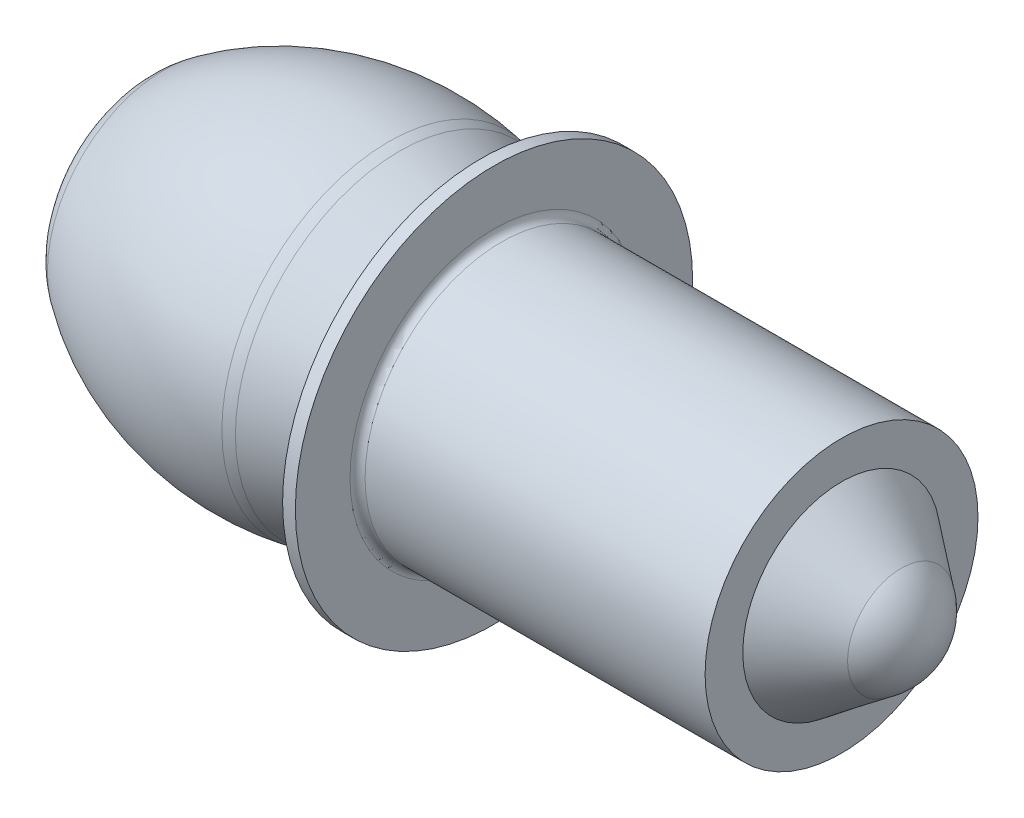
ISO-10303-21;
HEADER;
FILE_DESCRIPTION(('STEP AP214'),'2;1');
FILE_NAME('part.step','',(''),(''),'','','');
FILE_SCHEMA(('AUTOMOTIVE_DESIGN { 1 0 10303 214 1 1 1 1 }'));
ENDSEC;
DATA;
#1=APPLICATION_CONTEXT('core data for automotive mechanical design processes');
#2=APPLICATION_PROTOCOL_DEFINITION('international standard','automotive_design',2000,#1);
#3=PRODUCT_CONTEXT('',#1,'mechanical');
#4=PRODUCT('Part','Part','',(#3));
#5=PRODUCT_RELATED_PRODUCT_CATEGORY('part','',(#4));
#6=PRODUCT_DEFINITION_FORMATION('','',#4);
#7=PRODUCT_DEFINITION_CONTEXT('part definition',#1,'design');
#8=PRODUCT_DEFINITION('design','',#6,#7);
#9=PRODUCT_DEFINITION_SHAPE('','',#8);
#10=(LENGTH_UNIT() NAMED_UNIT(*) SI_UNIT(.MILLI.,.METRE.));
#11=(NAMED_UNIT(*) PLANE_ANGLE_UNIT() SI_UNIT($,.RADIAN.));
#12=(NAMED_UNIT(*) SI_UNIT($,.STERADIAN.) SOLID_ANGLE_UNIT());
#13=UNCERTAINTY_MEASURE_WITH_UNIT(LENGTH_MEASURE(1.E-05),#10,'distance_accuracy_value','');
#14=(GEOMETRIC_REPRESENTATION_CONTEXT(3) GLOBAL_UNCERTAINTY_ASSIGNED_CONTEXT((#13)) GLOBAL_UNIT_ASSIGNED_CONTEXT((#10,
#11,#12)) REPRESENTATION_CONTEXT('',''));
#15=CARTESIAN_POINT('',(0.,0.,0.));
#16=DIRECTION('',(0.,0.,1.));
#17=DIRECTION('',(1.,0.,0.));
#18=AXIS2_PLACEMENT_3D('',#15,#16,#17);
#19=CARTESIAN_POINT('',(0.155422630584212,-17.1253505507473,0.));
#20=DIRECTION('',(-1.,0.,0.));
#21=DIRECTION('',(0.,0.,1.));
#22=AXIS2_PLACEMENT_3D('',#19,#20,#21);
#23=PLANE('',#22);
#24=CARTESIAN_POINT('',(0.155422630584212,6.6929,0.));
#25=DIRECTION('',(-1.,0.,0.));
#26=DIRECTION('',(0.,0.,1.));
#27=AXIS2_PLACEMENT_3D('',#24,#25,#26);
#28=CIRCLE('',#27,0.030196754870487);
#29=CARTESIAN_POINT('',(0.155422630584212,6.6929,0.030196754870487));
#30=VERTEX_POINT('',#29);
#31=EDGE_CURVE('E11',#30,#30,#28,.T.);
#32=ORIENTED_EDGE('',*,*,#31,.T.);
#33=EDGE_LOOP('',(#32));
#34=FACE_BOUND('',#33,.T.);
#35=ADVANCED_FACE('F30',(#34),#23,.T.);
#36=CARTESIAN_POINT('',(0.790422630584212,6.6929,0.));
#37=DIRECTION('',(-1.,0.,0.));
#38=DIRECTION('',(0.,0.,1.));
#39=AXIS2_PLACEMENT_3D('',#36,#37,#38);
#40=DEGENERATE_TOROIDAL_SURFACE('',#39,0.0301967548704896,0.635,.T.);
#41=CARTESIAN_POINT('',(0.266573118640293,6.6929,0.));
#42=DIRECTION('',(-1.,0.,0.));
#43=DIRECTION('',(0.,0.,1.));
#44=AXIS2_PLACEMENT_3D('',#41,#42,#43);
#45=CIRCLE('',#44,0.389093242504629);
#46=CARTESIAN_POINT('',(0.266573118640293,6.6929,-0.389093242504629));
#47=VERTEX_POINT('',#46);
#48=EDGE_CURVE('E36',#47,#47,#45,.T.);
#49=ORIENTED_EDGE('',*,*,#48,.T.);
#50=EDGE_LOOP('',(#49));
#51=FACE_BOUND('',#50,.T.);
#52=ORIENTED_EDGE('',*,*,#31,.F.);
#53=EDGE_LOOP('',(#52));
#54=FACE_BOUND('',#53,.T.);
#55=ADVANCED_FACE('F88',(#51,#54),#40,.T.);
#56=CARTESIAN_POINT('',(0.266573118640293,6.6929,0.));
#57=DIRECTION('',(1.,0.,0.));
#58=DIRECTION('',(0.,0.,-1.));
#59=AXIS2_PLACEMENT_3D('',#56,#57,#58);
#60=CONICAL_SURFACE('',#59,0.389093242504629,0.970131178399944);
#61=CARTESIAN_POINT('',(0.906722652079457,6.6929,0.));
#62=DIRECTION('',(-1.,0.,0.));
#63=DIRECTION('',(0.,0.,1.));
#64=AXIS2_PLACEMENT_3D('',#61,#62,#63);
#65=CIRCLE('',#64,1.32346299037767);
#66=CARTESIAN_POINT('',(0.906722652079457,6.6929,-1.32346299037767));
#67=VERTEX_POINT('',#66);
#68=EDGE_CURVE('E83',#67,#67,#65,.T.);
#69=CARTESIAN_POINT('',(0.906722652079457,6.6929,-1.32346299037767));
#70=CARTESIAN_POINT('',(0.900054427772799,6.6929,-1.31372997217066));
#71=CARTESIAN_POINT('',(0.893386203466141,6.6929,-1.30399695396365));
#72=CARTESIAN_POINT('',(0.880049754852825,6.6929,-1.28453091754963));
#73=CARTESIAN_POINT('',(0.873381530546167,6.6929,-1.27479789934262));
#74=CARTESIAN_POINT('',(0.860045081932851,6.6929,-1.2553318629286));
#75=CARTESIAN_POINT('',(0.853376857626193,6.6929,-1.24559884472159));
#76=CARTESIAN_POINT('',(0.840040409012877,6.6929,-1.22613280830757));
#77=CARTESIAN_POINT('',(0.833372184706219,6.6929,-1.21639979010055));
#78=CARTESIAN_POINT('',(0.820035736092903,6.6929,-1.19693375368653));
#79=CARTESIAN_POINT('',(0.813367511786245,6.6929,-1.18720073547952));
#80=CARTESIAN_POINT('',(0.800031063172929,6.6929,-1.1677346990655));
#81=CARTESIAN_POINT('',(0.793362838866272,6.6929,-1.15800168085849));
#82=CARTESIAN_POINT('',(0.780026390252956,6.6929,-1.13853564444447));
#83=CARTESIAN_POINT('',(0.773358165946298,6.6929,-1.12880262623746));
#84=CARTESIAN_POINT('',(0.760021717332982,6.6929,-1.10933658982344));
#85=CARTESIAN_POINT('',(0.753353493026324,6.6929,-1.09960357161642));
#86=CARTESIAN_POINT('',(0.740017044413008,6.6929,-1.0801375352024));
#87=CARTESIAN_POINT('',(0.73334882010635,6.6929,-1.07040451699539));
#88=CARTESIAN_POINT('',(0.720012371493034,6.6929,-1.05093848058137));
#89=CARTESIAN_POINT('',(0.713344147186376,6.6929,-1.04120546237436));
#90=CARTESIAN_POINT('',(0.70000769857306,6.6929,-1.02173942596034));
#91=CARTESIAN_POINT('',(0.693339474266402,6.6929,-1.01200640775333));
#92=CARTESIAN_POINT('',(0.680003025653086,6.6929,-0.992540371339305));
#93=CARTESIAN_POINT('',(0.673334801346428,6.6929,-0.982807353132294));
#94=CARTESIAN_POINT('',(0.659998352733112,6.6929,-0.963341316718272));
#95=CARTESIAN_POINT('',(0.653330128426454,6.6929,-0.953608298511261));
#96=CARTESIAN_POINT('',(0.639993679813139,6.6929,-0.934142262097239));
#97=CARTESIAN_POINT('',(0.633325455506481,6.6929,-0.924409243890228));
#98=CARTESIAN_POINT('',(0.619989006893165,6.6929,-0.904943207476206));
#99=CARTESIAN_POINT('',(0.613320782586507,6.6929,-0.895210189269196));
#100=CARTESIAN_POINT('',(0.599984333973191,6.6929,-0.875744152855174));
#101=CARTESIAN_POINT('',(0.593316109666533,6.6929,-0.866011134648163));
#102=CARTESIAN_POINT('',(0.579979661053217,6.6929,-0.846545098234141));
#103=CARTESIAN_POINT('',(0.573311436746559,6.6929,-0.83681208002713));
#104=CARTESIAN_POINT('',(0.559974988133243,6.6929,-0.817346043613108));
#105=CARTESIAN_POINT('',(0.553306763826585,6.6929,-0.807613025406098));
#106=CARTESIAN_POINT('',(0.539970315213269,6.6929,-0.788146988992076));
#107=CARTESIAN_POINT('',(0.533302090906611,6.6929,-0.778413970785065));
#108=CARTESIAN_POINT('',(0.519965642293295,6.6929,-0.758947934371043));
#109=CARTESIAN_POINT('',(0.513297417986637,6.6929,-0.749214916164032));
#110=CARTESIAN_POINT('',(0.499960969373321,6.6929,-0.72974887975001));
#111=CARTESIAN_POINT('',(0.493292745066663,6.6929,-0.720015861543));
#112=CARTESIAN_POINT('',(0.479956296453348,6.6929,-0.700549825128978));
#113=CARTESIAN_POINT('',(0.47328807214669,6.6929,-0.690816806921967));
#114=CARTESIAN_POINT('',(0.459951623533374,6.6929,-0.671350770507945));
#115=CARTESIAN_POINT('',(0.453283399226716,6.6929,-0.661617752300934));
#116=CARTESIAN_POINT('',(0.4399469506134,6.6929,-0.642151715886912));
#117=CARTESIAN_POINT('',(0.433278726306742,6.6929,-0.632418697679902));
#118=CARTESIAN_POINT('',(0.419942277693426,6.6929,-0.61295266126588));
#119=CARTESIAN_POINT('',(0.413274053386768,6.6929,-0.603219643058869));
#120=CARTESIAN_POINT('',(0.399937604773452,6.6929,-0.583753606644847));
#121=CARTESIAN_POINT('',(0.393269380466794,6.6929,-0.574020588437836));
#122=CARTESIAN_POINT('',(0.379932931853478,6.6929,-0.554554552023814));
#123=CARTESIAN_POINT('',(0.37326470754682,6.6929,-0.544821533816804));
#124=CARTESIAN_POINT('',(0.359928258933504,6.6929,-0.525355497402782));
#125=CARTESIAN_POINT('',(0.353260034626846,6.6929,-0.515622479195771));
#126=CARTESIAN_POINT('',(0.33992358601353,6.6929,-0.496156442781749));
#127=CARTESIAN_POINT('',(0.333255361706872,6.6929,-0.486423424574738));
#128=CARTESIAN_POINT('',(0.319918913093557,6.6929,-0.466957388160716));
#129=CARTESIAN_POINT('',(0.313250688786899,6.6929,-0.457224369953706));
#130=CARTESIAN_POINT('',(0.299914240173583,6.6929,-0.437758333539684));
#131=CARTESIAN_POINT('',(0.293246015866925,6.6929,-0.428025315332673));
#132=CARTESIAN_POINT('',(0.279909567253609,6.6929,-0.408559278918651));
#133=CARTESIAN_POINT('',(0.273241342946951,6.6929,-0.39882626071164));
#134=CARTESIAN_POINT('',(0.266573118640293,6.6929,-0.389093242504629));
#135=B_SPLINE_CURVE_WITH_KNOTS('',3,(#69,#70,#71,#72,#73,#74,#75,#76,#77,#78,#79,#80,#81,#82,
#83,#84,#85,#86,#87,#88,#89,#90,#91,#92,#93,#94,#95,#96,#97,#98,#99,#100,#101,#102,#103,#104,
#105,#106,#107,#108,#109,#110,#111,#112,#113,#114,#115,#116,#117,#118,#119,#120,#121,#122,#123,
#124,#125,#126,#127,#128,#129,#130,#131,#132,#133,#134),.UNSPECIFIED.,.F.,.F.,(4,2,2,2,2,2,2,2,
2,2,2,2,2,2,2,2,2,2,2,2,2,2,2,2,2,2,2,2,2,2,2,2,4),(0.,0.0353945155270868,0.0707890310541735,
0.10618354658126,0.141578062108347,0.176972577635434,0.212367093162521,0.247761608689607,
0.283156124216694,0.318550639743781,0.353945155270868,0.389339670797954,0.424734186325041,
0.460128701852128,0.495523217379215,0.530917732906301,0.566312248433388,0.601706763960475,
0.637101279487561,0.672495795014648,0.707890310541735,0.743284826068822,0.778679341595908,
0.814073857122995,0.849468372650082,0.884862888177169,0.920257403704255,0.955651919231342,
0.991046434758429,1.02644095028552,1.0618354658126,1.09722998133969,1.13262449686678),.UNSPECIFIED.);
#136=EDGE_CURVE('BSEAM91',#67,#47,#135,.T.);
#137=ORIENTED_EDGE('',*,*,#68,.T.);
#138=ORIENTED_EDGE('',*,*,#48,.F.);
#139=ORIENTED_EDGE('',*,*,#136,.T.);
#140=ORIENTED_EDGE('',*,*,#136,.F.);
#141=EDGE_LOOP('',(#137,#139,#138,#140));
#142=FACE_BOUND('',#141,.T.);
#143=ADVANCED_FACE('F91',(#142),#60,.T.);
#144=CARTESIAN_POINT('',(-1.18867539569621,6.6929,0.));
#145=DIRECTION('',(-1.,0.,0.));
#146=DIRECTION('',(0.,0.,1.));
#147=AXIS2_PLACEMENT_3D('',#144,#145,#146);
#148=TOROIDAL_SURFACE('',#147,2.75904894091423,2.54);
#149=ORIENTED_EDGE('',*,*,#68,.F.);
#150=EDGE_LOOP('',(#149));
#151=FACE_BOUND('',#150,.T.);
#152=CARTESIAN_POINT('',(1.3106623021519,6.6929,0.));
#153=DIRECTION('',(-1.,0.,0.));
#154=DIRECTION('',(0.,0.,1.));
#155=AXIS2_PLACEMENT_3D('',#152,#153,#154);
#156=CIRCLE('',#155,2.30637789907994);
#157=CARTESIAN_POINT('',(1.3106623021519,6.6929,2.30637789907994));
#158=VERTEX_POINT('',#157);
#159=EDGE_CURVE('E80',#158,#158,#156,.T.);
#160=ORIENTED_EDGE('',*,*,#159,.T.);
#161=EDGE_LOOP('',(#160));
#162=FACE_BOUND('',#161,.T.);
#163=ADVANCED_FACE('F93',(#151,#162),#148,.F.);
#164=CARTESIAN_POINT('',(3.81,6.6929,0.));
#165=DIRECTION('',(-1.,0.,0.));
#166=DIRECTION('',(0.,0.,1.));
#167=AXIS2_PLACEMENT_3D('',#164,#165,#166);
#168=DEGENERATE_TOROIDAL_SURFACE('',#167,1.85370685724564,2.54,.T.);
#169=ORIENTED_EDGE('',*,*,#159,.F.);
#170=EDGE_LOOP('',(#169));
#171=FACE_BOUND('',#170,.T.);
#172=CARTESIAN_POINT('',(2.33885019120187,6.6929,0.));
#173=DIRECTION('',(-1.,0.,0.));
#174=DIRECTION('',(0.,0.,1.));
#175=AXIS2_PLACEMENT_3D('',#172,#173,#174);
#176=CIRCLE('',#175,3.92429089081521);
#177=CARTESIAN_POINT('',(2.33885019120187,6.6929,3.92429089081521));
#178=VERTEX_POINT('',#177);
#179=EDGE_CURVE('E77',#178,#178,#176,.T.);
#180=ORIENTED_EDGE('',*,*,#179,.T.);
#181=EDGE_LOOP('',(#180));
#182=FACE_BOUND('',#181,.T.);
#183=ADVANCED_FACE('F100',(#171,#182),#168,.T.);
#184=CARTESIAN_POINT('',(8.14552882872837,6.6929,0.));
#185=DIRECTION('',(-1.,0.,0.));
#186=DIRECTION('',(0.,0.,1.));
#187=AXIS2_PLACEMENT_3D('',#184,#185,#186);
#188=DEGENERATE_TOROIDAL_SURFACE('',#187,4.24837514430081,10.025466917857,.F.);
#189=CARTESIAN_POINT('',(9.91286723306351,6.6929,0.));
#190=DIRECTION('',(-1.,0.,0.));
#191=DIRECTION('',(0.,0.,1.));
#192=AXIS2_PLACEMENT_3D('',#189,#190,#191);
#193=CIRCLE('',#192,5.62008481080909);
#194=CARTESIAN_POINT('',(9.91286723306351,6.6929,5.62008481080909));
#195=VERTEX_POINT('',#194);
#196=EDGE_CURVE('E74',#195,#195,#193,.T.);
#197=ORIENTED_EDGE('',*,*,#196,.T.);
#198=EDGE_LOOP('',(#197));
#199=FACE_BOUND('',#198,.T.);
#200=ORIENTED_EDGE('',*,*,#179,.F.);
#201=EDGE_LOOP('',(#200));
#202=FACE_BOUND('',#201,.T.);
#203=ADVANCED_FACE('F131',(#199,#202),#188,.F.);
#204=CARTESIAN_POINT('',(9.46510359434305,6.6929,0.));
#205=DIRECTION('',(-1.,0.,0.));
#206=DIRECTION('',(0.,0.,1.));
#207=AXIS2_PLACEMENT_3D('',#204,#205,#206);
#208=TOROIDAL_SURFACE('',#207,3.11986327585667,2.54);
#209=ORIENTED_EDGE('',*,*,#196,.F.);
#210=EDGE_LOOP('',(#209));
#211=FACE_BOUND('',#210,.T.);
#212=CARTESIAN_POINT('',(10.2767729214205,6.6929,0.));
#213=DIRECTION('',(-1.,0.,0.));
#214=DIRECTION('',(0.,0.,1.));
#215=AXIS2_PLACEMENT_3D('',#212,#213,#214);
#216=CIRCLE('',#215,5.52668543453014);
#217=CARTESIAN_POINT('',(10.2767729214205,6.6929,5.52668543453014));
#218=VERTEX_POINT('',#217);
#219=EDGE_CURVE('E71',#218,#218,#216,.T.);
#220=ORIENTED_EDGE('',*,*,#219,.T.);
#221=EDGE_LOOP('',(#220));
#222=FACE_BOUND('',#221,.T.);
#223=ADVANCED_FACE('F141',(#211,#222),#208,.T.);
#224=CARTESIAN_POINT('',(13.0323590954268,6.6929,0.));
#225=DIRECTION('',(-1.,0.,0.));
#226=DIRECTION('',(0.,0.,1.));
#227=AXIS2_PLACEMENT_3D('',#224,#225,#226);
#228=CONICAL_SURFACE('',#227,4.5974,0.32525967171703);
#229=ORIENTED_EDGE('',*,*,#219,.F.);
#230=EDGE_LOOP('',(#229));
#231=FACE_BOUND('',#230,.T.);
#232=CARTESIAN_POINT('',(13.0323590954268,6.6929,0.));
#233=DIRECTION('',(-1.,0.,0.));
#234=DIRECTION('',(0.,0.,1.));
#235=AXIS2_PLACEMENT_3D('',#232,#233,#234);
#236=CIRCLE('',#235,4.5974);
#237=CARTESIAN_POINT('',(13.0323590954268,6.6929,4.5974));
#238=VERTEX_POINT('',#237);
#239=EDGE_CURVE('E68',#238,#238,#236,.T.);
#240=ORIENTED_EDGE('',*,*,#239,.T.);
#241=EDGE_LOOP('',(#240));
#242=FACE_BOUND('',#241,.T.);
#243=ADVANCED_FACE('F151',(#231,#242),#228,.T.);
#244=CARTESIAN_POINT('',(13.0323590954268,-17.1253505507473,0.));
#245=DIRECTION('',(-1.,0.,0.));
#246=DIRECTION('',(0.,0.,1.));
#247=AXIS2_PLACEMENT_3D('',#244,#245,#246);
#248=PLANE('',#247);
#249=CARTESIAN_POINT('',(13.0323590954268,6.6929,0.));
#250=DIRECTION('',(-1.,0.,0.));
#251=DIRECTION('',(0.,0.,1.));
#252=AXIS2_PLACEMENT_3D('',#249,#250,#251);
#253=CIRCLE('',#252,6.6929);
#254=CARTESIAN_POINT('',(13.0323590954268,6.6929,6.6929));
#255=VERTEX_POINT('',#254);
#256=EDGE_CURVE('E65',#255,#255,#253,.T.);
#257=ORIENTED_EDGE('',*,*,#256,.T.);
#258=EDGE_LOOP('',(#257));
#259=FACE_BOUND('',#258,.T.);
#260=ORIENTED_EDGE('',*,*,#239,.F.);
#261=EDGE_LOOP('',(#260));
#262=FACE_BOUND('',#261,.T.);
#263=ADVANCED_FACE('F161',(#259,#262),#248,.T.);
#264=CARTESIAN_POINT('',(0.,6.6929,0.));
#265=DIRECTION('',(-1.,0.,0.));
#266=DIRECTION('',(0.,0.,1.));
#267=AXIS2_PLACEMENT_3D('',#264,#265,#266);
#268=CYLINDRICAL_SURFACE('',#267,6.6929);
#269=CARTESIAN_POINT('',(13.462,6.6929,0.));
#270=DIRECTION('',(-1.,0.,0.));
#271=DIRECTION('',(0.,0.,1.));
#272=AXIS2_PLACEMENT_3D('',#269,#270,#271);
#273=CIRCLE('',#272,6.6929);
#274=CARTESIAN_POINT('',(13.462,6.6929,6.6929));
#275=VERTEX_POINT('',#274);
#276=EDGE_CURVE('E62',#275,#275,#273,.T.);
#277=ORIENTED_EDGE('',*,*,#276,.T.);
#278=EDGE_LOOP('',(#277));
#279=FACE_BOUND('',#278,.T.);
#280=ORIENTED_EDGE('',*,*,#256,.F.);
#281=EDGE_LOOP('',(#280));
#282=FACE_BOUND('',#281,.T.);
#283=ADVANCED_FACE('F171',(#279,#282),#268,.T.);
#284=CARTESIAN_POINT('',(13.462,-17.1253505507473,0.));
#285=DIRECTION('',(-1.,0.,0.));
#286=DIRECTION('',(0.,0.,1.));
#287=AXIS2_PLACEMENT_3D('',#284,#285,#286);
#288=PLANE('',#287);
#289=ORIENTED_EDGE('',*,*,#276,.F.);
#290=EDGE_LOOP('',(#289));
#291=FACE_BOUND('',#290,.T.);
#292=CARTESIAN_POINT('',(13.462,6.6929,0.));
#293=DIRECTION('',(-1.,0.,0.));
#294=DIRECTION('',(0.,0.,1.));
#295=AXIS2_PLACEMENT_3D('',#292,#293,#294);
#296=CIRCLE('',#295,4.8514);
#297=CARTESIAN_POINT('',(13.462,6.6929,4.8514));
#298=VERTEX_POINT('',#297);
#299=EDGE_CURVE('E59',#298,#298,#296,.T.);
#300=ORIENTED_EDGE('',*,*,#299,.T.);
#301=EDGE_LOOP('',(#300));
#302=FACE_BOUND('',#301,.T.);
#303=ADVANCED_FACE('F181',(#291,#302),#288,.F.);
#304=CARTESIAN_POINT('',(13.716,6.6929,0.));
#305=DIRECTION('',(-1.,0.,0.));
#306=DIRECTION('',(0.,0.,1.));
#307=AXIS2_PLACEMENT_3D('',#304,#305,#306);
#308=TOROIDAL_SURFACE('',#307,4.8514,0.254);
#309=ORIENTED_EDGE('',*,*,#299,.F.);
#310=EDGE_LOOP('',(#309));
#311=FACE_BOUND('',#310,.T.);
#312=CARTESIAN_POINT('',(13.716,6.6929,0.));
#313=DIRECTION('',(-1.,0.,0.));
#314=DIRECTION('',(0.,0.,1.));
#315=AXIS2_PLACEMENT_3D('',#312,#313,#314);
#316=CIRCLE('',#315,4.5974);
#317=CARTESIAN_POINT('',(13.716,6.6929,4.5974));
#318=VERTEX_POINT('',#317);
#319=EDGE_CURVE('E56',#318,#318,#316,.T.);
#320=ORIENTED_EDGE('',*,*,#319,.T.);
#321=EDGE_LOOP('',(#320));
#322=FACE_BOUND('',#321,.T.);
#323=ADVANCED_FACE('F191',(#311,#322),#308,.F.);
#324=CARTESIAN_POINT('',(0.,6.6929,0.));
#325=DIRECTION('',(-1.,0.,0.));
#326=DIRECTION('',(0.,0.,1.));
#327=AXIS2_PLACEMENT_3D('',#324,#325,#326);
#328=CYLINDRICAL_SURFACE('',#327,4.5974);
#329=ORIENTED_EDGE('',*,*,#319,.F.);
#330=EDGE_LOOP('',(#329));
#331=FACE_BOUND('',#330,.T.);
#332=CARTESIAN_POINT('',(25.1714,6.6929,0.));
#333=DIRECTION('',(-1.,0.,0.));
#334=DIRECTION('',(0.,0.,1.));
#335=AXIS2_PLACEMENT_3D('',#332,#333,#334);
#336=CIRCLE('',#335,4.5974);
#337=CARTESIAN_POINT('',(25.1714,6.6929,4.5974));
#338=VERTEX_POINT('',#337);
#339=EDGE_CURVE('E51',#338,#338,#336,.T.);
#340=ORIENTED_EDGE('',*,*,#339,.T.);
#341=EDGE_LOOP('',(#340));
#342=FACE_BOUND('',#341,.T.);
#343=ADVANCED_FACE('F201',(#331,#342),#328,.T.);
#344=CARTESIAN_POINT('',(25.1714,-17.1253505507473,0.));
#345=DIRECTION('',(1.,0.,0.));
#346=DIRECTION('',(0.,0.,-1.));
#347=AXIS2_PLACEMENT_3D('',#344,#345,#346);
#348=PLANE('',#347);
#349=CARTESIAN_POINT('',(25.1714,6.6929,0.));
#350=DIRECTION('',(-1.,0.,0.));
#351=DIRECTION('',(0.,0.,1.));
#352=AXIS2_PLACEMENT_3D('',#349,#350,#351);
#353=CIRCLE('',#352,3.3274);
#354=CARTESIAN_POINT('',(25.1714,6.6929,3.3274));
#355=VERTEX_POINT('',#354);
#356=EDGE_CURVE('E48',#355,#355,#353,.T.);
#357=ORIENTED_EDGE('',*,*,#356,.T.);
#358=EDGE_LOOP('',(#357));
#359=FACE_BOUND('',#358,.T.);
#360=ORIENTED_EDGE('',*,*,#339,.F.);
#361=EDGE_LOOP('',(#360));
#362=FACE_BOUND('',#361,.T.);
#363=ADVANCED_FACE('F211',(#359,#362),#348,.T.);
#364=CARTESIAN_POINT('',(25.1714,6.6929,0.));
#365=DIRECTION('',(-1.,0.,0.));
#366=DIRECTION('',(0.,0.,1.));
#367=AXIS2_PLACEMENT_3D('',#364,#365,#366);
#368=CONICAL_SURFACE('',#367,3.3274,0.649549422135658);
#369=CARTESIAN_POINT('',(27.178,6.6929,0.));
#370=DIRECTION('',(-1.,0.,0.));
#371=DIRECTION('',(0.,0.,1.));
#372=AXIS2_PLACEMENT_3D('',#369,#370,#371);
#373=CIRCLE('',#372,1.8034);
#374=CARTESIAN_POINT('',(27.178,6.6929,1.8034));
#375=VERTEX_POINT('',#374);
#376=EDGE_CURVE('E46',#375,#375,#373,.T.);
#377=ORIENTED_EDGE('',*,*,#376,.T.);
#378=EDGE_LOOP('',(#377));
#379=FACE_BOUND('',#378,.T.);
#380=ORIENTED_EDGE('',*,*,#356,.F.);
#381=EDGE_LOOP('',(#380));
#382=FACE_BOUND('',#381,.T.);
#383=ADVANCED_FACE('F42',(#379,#382),#368,.T.);
#384=CARTESIAN_POINT('',(25.9228275783129,6.6929,-0.123803792805224));
#385=DIRECTION('',(0.,-1.,0.));
#386=DIRECTION('',(0.,0.,1.));
#387=AXIS2_PLACEMENT_3D('',#384,#385,#386);
#388=CIRCLE('',#387,2.29990701272176);
#389=TRIMMED_CURVE('',#388,(PARAMETER_VALUE(-1.51694038374012)),
(PARAMETER_VALUE(1.51694038374012)),.T.,.PARAMETER.);
#390=CARTESIAN_POINT('',(25.9228275783129,6.6929,0.));
#391=DIRECTION('',(-1.,0.,0.));
#392=AXIS1_PLACEMENT('',#390,#391);
#393=SURFACE_OF_REVOLUTION('',#389,#392);
#394=CARTESIAN_POINT('',(28.2194,6.6929,0.));
#395=VERTEX_POINT('',#394);
#396=VERTEX_LOOP('',#395);
#397=FACE_BOUND('',#396,.T.);
#398=ORIENTED_EDGE('',*,*,#376,.F.);
#399=EDGE_LOOP('',(#398));
#400=FACE_BOUND('',#399,.T.);
#401=ADVANCED_FACE('F39',(#397,#400),#393,.T.);
#402=CLOSED_SHELL('',(#35,#55,#143,#163,#183,#203,#223,#243,#263,#283,#303,#323,#343,#363,#383,#401));
#403=MANIFOLD_SOLID_BREP('B2',#402);
#404=ADVANCED_BREP_SHAPE_REPRESENTATION('',(#18,#403),#14);
#405=SHAPE_DEFINITION_REPRESENTATION(#9,#404);
ENDSEC;
END-ISO-10303-21;
